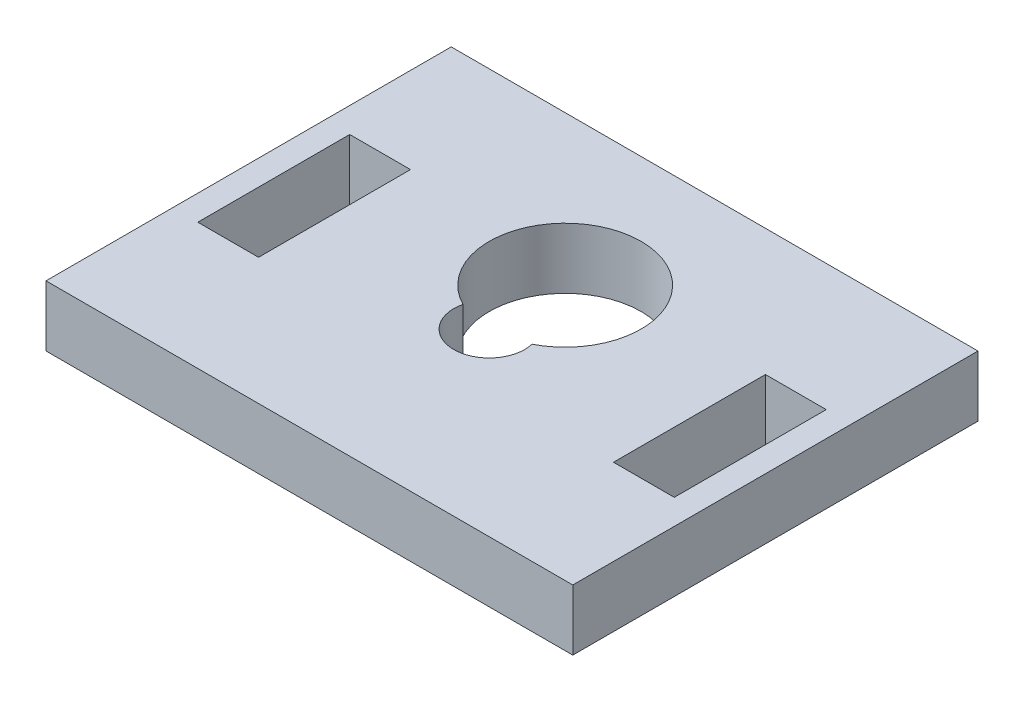
ISO-10303-21;
HEADER;
FILE_DESCRIPTION(('STEP AP214'),'2;1');
FILE_NAME('part.step','',(''),(''),'','','');
FILE_SCHEMA(('AUTOMOTIVE_DESIGN { 1 0 10303 214 1 1 1 1 }'));
ENDSEC;
DATA;
#1=APPLICATION_CONTEXT('core data for automotive mechanical design processes');
#2=APPLICATION_PROTOCOL_DEFINITION('international standard','automotive_design',2000,#1);
#3=PRODUCT_CONTEXT('',#1,'mechanical');
#4=PRODUCT('Part','Part','',(#3));
#5=PRODUCT_RELATED_PRODUCT_CATEGORY('part','',(#4));
#6=PRODUCT_DEFINITION_FORMATION('','',#4);
#7=PRODUCT_DEFINITION_CONTEXT('part definition',#1,'design');
#8=PRODUCT_DEFINITION('design','',#6,#7);
#9=PRODUCT_DEFINITION_SHAPE('','',#8);
#10=(LENGTH_UNIT() NAMED_UNIT(*) SI_UNIT(.MILLI.,.METRE.));
#11=(NAMED_UNIT(*) PLANE_ANGLE_UNIT() SI_UNIT($,.RADIAN.));
#12=(NAMED_UNIT(*) SI_UNIT($,.STERADIAN.) SOLID_ANGLE_UNIT());
#13=UNCERTAINTY_MEASURE_WITH_UNIT(LENGTH_MEASURE(1.E-05),#10,'distance_accuracy_value','');
#14=(GEOMETRIC_REPRESENTATION_CONTEXT(3) GLOBAL_UNCERTAINTY_ASSIGNED_CONTEXT((#13)) GLOBAL_UNIT_ASSIGNED_CONTEXT((#10,
#11,#12)) REPRESENTATION_CONTEXT('',''));
#15=CARTESIAN_POINT('',(0.,0.,0.));
#16=DIRECTION('',(0.,0.,1.));
#17=DIRECTION('',(1.,0.,0.));
#18=AXIS2_PLACEMENT_3D('',#15,#16,#17);
#19=CARTESIAN_POINT('',(26.,3.,20.));
#20=DIRECTION('',(-1.,0.,0.));
#21=DIRECTION('',(0.,0.,1.));
#22=AXIS2_PLACEMENT_3D('',#19,#20,#21);
#23=PLANE('',#22);
#24=DIRECTION('',(0.,0.,-1.));
#25=VECTOR('',#24,1.);
#26=CARTESIAN_POINT('',(26.,-3.,20.));
#27=LINE('',#26,#25);
#28=CARTESIAN_POINT('',(26.,-3.,20.));
#29=VERTEX_POINT('',#28);
#30=CARTESIAN_POINT('',(26.,-3.,-20.));
#31=VERTEX_POINT('',#30);
#32=EDGE_CURVE('E178',#29,#31,#27,.T.);
#33=ORIENTED_EDGE('',*,*,#32,.T.);
#34=DIRECTION('',(0.,-1.,0.));
#35=VECTOR('',#34,1.);
#36=CARTESIAN_POINT('',(26.,3.,-20.));
#37=LINE('',#36,#35);
#38=CARTESIAN_POINT('',(26.,3.,-20.));
#39=VERTEX_POINT('',#38);
#40=EDGE_CURVE('E11',#39,#31,#37,.T.);
#41=ORIENTED_EDGE('',*,*,#40,.F.);
#42=DIRECTION('',(0.,0.,-1.));
#43=VECTOR('',#42,1.);
#44=CARTESIAN_POINT('',(26.,3.,20.));
#45=LINE('',#44,#43);
#46=CARTESIAN_POINT('',(26.,3.,20.));
#47=VERTEX_POINT('',#46);
#48=EDGE_CURVE('E215',#47,#39,#45,.T.);
#49=ORIENTED_EDGE('',*,*,#48,.F.);
#50=DIRECTION('',(0.,-1.,0.));
#51=VECTOR('',#50,1.);
#52=CARTESIAN_POINT('',(26.,3.,20.));
#53=LINE('',#52,#51);
#54=EDGE_CURVE('E225',#47,#29,#53,.T.);
#55=ORIENTED_EDGE('',*,*,#54,.T.);
#56=EDGE_LOOP('',(#33,#41,#49,#55));
#57=FACE_BOUND('',#56,.T.);
#58=ADVANCED_FACE('F33',(#57),#23,.F.);
#59=CARTESIAN_POINT('',(-26.,3.,-20.));
#60=DIRECTION('',(0.,0.,1.));
#61=DIRECTION('',(1.,0.,0.));
#62=AXIS2_PLACEMENT_3D('',#59,#60,#61);
#63=PLANE('',#62);
#64=DIRECTION('',(-1.,0.,0.));
#65=VECTOR('',#64,1.);
#66=CARTESIAN_POINT('',(-26.,-3.,-20.));
#67=LINE('',#66,#65);
#68=CARTESIAN_POINT('',(-26.,-3.,-20.));
#69=VERTEX_POINT('',#68);
#70=EDGE_CURVE('E228',#31,#69,#67,.T.);
#71=ORIENTED_EDGE('',*,*,#70,.T.);
#72=DIRECTION('',(0.,-1.,0.));
#73=VECTOR('',#72,1.);
#74=CARTESIAN_POINT('',(-26.,3.,-20.));
#75=LINE('',#74,#73);
#76=CARTESIAN_POINT('',(-26.,3.,-20.));
#77=VERTEX_POINT('',#76);
#78=EDGE_CURVE('E40',#77,#69,#75,.T.);
#79=ORIENTED_EDGE('',*,*,#78,.F.);
#80=DIRECTION('',(-1.,0.,0.));
#81=VECTOR('',#80,1.);
#82=CARTESIAN_POINT('',(-26.,3.,-20.));
#83=LINE('',#82,#81);
#84=EDGE_CURVE('E218',#39,#77,#83,.T.);
#85=ORIENTED_EDGE('',*,*,#84,.F.);
#86=ORIENTED_EDGE('',*,*,#40,.T.);
#87=EDGE_LOOP('',(#71,#79,#85,#86));
#88=FACE_BOUND('',#87,.T.);
#89=ADVANCED_FACE('F257',(#88),#63,.F.);
#90=CARTESIAN_POINT('',(-26.,3.,20.));
#91=DIRECTION('',(1.,0.,0.));
#92=DIRECTION('',(0.,0.,-1.));
#93=AXIS2_PLACEMENT_3D('',#90,#91,#92);
#94=PLANE('',#93);
#95=DIRECTION('',(0.,0.,1.));
#96=VECTOR('',#95,1.);
#97=CARTESIAN_POINT('',(-26.,-3.,20.));
#98=LINE('',#97,#96);
#99=CARTESIAN_POINT('',(-26.,-3.,20.));
#100=VERTEX_POINT('',#99);
#101=EDGE_CURVE('E230',#69,#100,#98,.T.);
#102=ORIENTED_EDGE('',*,*,#101,.T.);
#103=DIRECTION('',(0.,-1.,0.));
#104=VECTOR('',#103,1.);
#105=CARTESIAN_POINT('',(-26.,3.,20.));
#106=LINE('',#105,#104);
#107=CARTESIAN_POINT('',(-26.,3.,20.));
#108=VERTEX_POINT('',#107);
#109=EDGE_CURVE('E235',#108,#100,#106,.T.);
#110=ORIENTED_EDGE('',*,*,#109,.F.);
#111=DIRECTION('',(0.,0.,1.));
#112=VECTOR('',#111,1.);
#113=CARTESIAN_POINT('',(-26.,3.,20.));
#114=LINE('',#113,#112);
#115=EDGE_CURVE('E221',#77,#108,#114,.T.);
#116=ORIENTED_EDGE('',*,*,#115,.F.);
#117=ORIENTED_EDGE('',*,*,#78,.T.);
#118=EDGE_LOOP('',(#102,#110,#116,#117));
#119=FACE_BOUND('',#118,.T.);
#120=ADVANCED_FACE('F242',(#119),#94,.F.);
#121=CARTESIAN_POINT('',(-26.,3.,20.));
#122=DIRECTION('',(0.,0.,-1.));
#123=DIRECTION('',(-1.,0.,0.));
#124=AXIS2_PLACEMENT_3D('',#121,#122,#123);
#125=PLANE('',#124);
#126=DIRECTION('',(1.,0.,0.));
#127=VECTOR('',#126,1.);
#128=CARTESIAN_POINT('',(-26.,-3.,20.));
#129=LINE('',#128,#127);
#130=EDGE_CURVE('E219',#100,#29,#129,.T.);
#131=ORIENTED_EDGE('',*,*,#130,.T.);
#132=ORIENTED_EDGE('',*,*,#54,.F.);
#133=DIRECTION('',(1.,0.,0.));
#134=VECTOR('',#133,1.);
#135=CARTESIAN_POINT('',(-26.,3.,20.));
#136=LINE('',#135,#134);
#137=EDGE_CURVE('E223',#108,#47,#136,.T.);
#138=ORIENTED_EDGE('',*,*,#137,.F.);
#139=ORIENTED_EDGE('',*,*,#109,.T.);
#140=EDGE_LOOP('',(#131,#132,#138,#139));
#141=FACE_BOUND('',#140,.T.);
#142=ADVANCED_FACE('F250',(#141),#125,.F.);
#143=CARTESIAN_POINT('',(0.,3.,0.));
#144=DIRECTION('',(0.,-1.,0.));
#145=DIRECTION('',(0.,0.,-1.));
#146=AXIS2_PLACEMENT_3D('',#143,#144,#145);
#147=PLANE('',#146);
#148=CARTESIAN_POINT('',(-2.29850860566927E-12,3.,-5.25000000000031));
#149=DIRECTION('',(0.,1.,0.));
#150=DIRECTION('',(0.,0.,1.));
#151=AXIS2_PLACEMENT_3D('',#148,#149,#150);
#152=CIRCLE('',#151,7.5);
#153=CARTESIAN_POINT('',(3.40338883402321,3.,1.43333333333198));
#154=VERTEX_POINT('',#153);
#155=CARTESIAN_POINT('',(-3.40338883402371,3.,1.43333333333407));
#156=VERTEX_POINT('',#155);
#157=EDGE_CURVE('E144',#154,#156,#152,.T.);
#158=ORIENTED_EDGE('',*,*,#157,.F.);
#159=CARTESIAN_POINT('',(0.,3.,2.24999999999969));
#160=DIRECTION('',(0.,1.,0.));
#161=DIRECTION('',(0.,0.,1.));
#162=AXIS2_PLACEMENT_3D('',#159,#160,#161);
#163=CIRCLE('',#162,3.5);
#164=EDGE_CURVE('E47',#156,#154,#163,.T.);
#165=ORIENTED_EDGE('',*,*,#164,.F.);
#166=EDGE_LOOP('',(#158,#165));
#167=FACE_BOUND('',#166,.T.);
#168=DIRECTION('',(1.,0.,0.));
#169=VECTOR('',#168,1.);
#170=CARTESIAN_POINT('',(-23.5187499999947,3.,7.5));
#171=LINE('',#170,#169);
#172=CARTESIAN_POINT('',(-23.5187499999947,3.,7.5));
#173=VERTEX_POINT('',#172);
#174=CARTESIAN_POINT('',(-17.5187499999947,3.,7.5));
#175=VERTEX_POINT('',#174);
#176=EDGE_CURVE('E167',#173,#175,#171,.T.);
#177=ORIENTED_EDGE('',*,*,#176,.F.);
#178=DIRECTION('',(0.,0.,1.));
#179=VECTOR('',#178,1.);
#180=CARTESIAN_POINT('',(-23.5187499999947,3.,-7.5));
#181=LINE('',#180,#179);
#182=CARTESIAN_POINT('',(-23.5187499999947,3.,-7.5));
#183=VERTEX_POINT('',#182);
#184=EDGE_CURVE('E165',#183,#173,#181,.T.);
#185=ORIENTED_EDGE('',*,*,#184,.F.);
#186=DIRECTION('',(-1.,0.,0.));
#187=VECTOR('',#186,1.);
#188=CARTESIAN_POINT('',(-23.5187499999947,3.,-7.5));
#189=LINE('',#188,#187);
#190=CARTESIAN_POINT('',(-17.5187499999947,3.,-7.5));
#191=VERTEX_POINT('',#190);
#192=EDGE_CURVE('E155',#191,#183,#189,.T.);
#193=ORIENTED_EDGE('',*,*,#192,.F.);
#194=DIRECTION('',(0.,0.,-1.));
#195=VECTOR('',#194,1.);
#196=CARTESIAN_POINT('',(-17.5187499999947,3.,-7.5));
#197=LINE('',#196,#195);
#198=EDGE_CURVE('E171',#175,#191,#197,.T.);
#199=ORIENTED_EDGE('',*,*,#198,.F.);
#200=EDGE_LOOP('',(#177,#185,#193,#199));
#201=FACE_BOUND('',#200,.T.);
#202=DIRECTION('',(1.,0.,0.));
#203=VECTOR('',#202,1.);
#204=CARTESIAN_POINT('',(17.5187499999947,3.,7.49999999999999));
#205=LINE('',#204,#203);
#206=CARTESIAN_POINT('',(17.5187499999947,3.,7.49999999999999));
#207=VERTEX_POINT('',#206);
#208=CARTESIAN_POINT('',(23.5187499999947,3.,7.49999999999999));
#209=VERTEX_POINT('',#208);
#210=EDGE_CURVE('E200',#207,#209,#205,.T.);
#211=ORIENTED_EDGE('',*,*,#210,.F.);
#212=DIRECTION('',(0.,0.,1.));
#213=VECTOR('',#212,1.);
#214=CARTESIAN_POINT('',(17.5187499999947,3.,-7.50000000000001));
#215=LINE('',#214,#213);
#216=CARTESIAN_POINT('',(17.5187499999947,3.,-7.50000000000001));
#217=VERTEX_POINT('',#216);
#218=EDGE_CURVE('E149',#217,#207,#215,.T.);
#219=ORIENTED_EDGE('',*,*,#218,.F.);
#220=DIRECTION('',(-1.,0.,0.));
#221=VECTOR('',#220,1.);
#222=CARTESIAN_POINT('',(17.5187499999947,3.,-7.50000000000001));
#223=LINE('',#222,#221);
#224=CARTESIAN_POINT('',(23.5187499999947,3.,-7.50000000000001));
#225=VERTEX_POINT('',#224);
#226=EDGE_CURVE('E189',#225,#217,#223,.T.);
#227=ORIENTED_EDGE('',*,*,#226,.F.);
#228=DIRECTION('',(0.,0.,-1.));
#229=VECTOR('',#228,1.);
#230=CARTESIAN_POINT('',(23.5187499999947,3.,-7.50000000000001));
#231=LINE('',#230,#229);
#232=EDGE_CURVE('E203',#209,#225,#231,.T.);
#233=ORIENTED_EDGE('',*,*,#232,.F.);
#234=EDGE_LOOP('',(#211,#219,#227,#233));
#235=FACE_BOUND('',#234,.T.);
#236=ORIENTED_EDGE('',*,*,#48,.T.);
#237=ORIENTED_EDGE('',*,*,#84,.T.);
#238=ORIENTED_EDGE('',*,*,#115,.T.);
#239=ORIENTED_EDGE('',*,*,#137,.T.);
#240=EDGE_LOOP('',(#236,#237,#238,#239));
#241=FACE_BOUND('',#240,.T.);
#242=ADVANCED_FACE('F256',(#167,#201,#235,#241),#147,.F.);
#243=CARTESIAN_POINT('',(0.,-3.,0.));
#244=DIRECTION('',(0.,-1.,0.));
#245=DIRECTION('',(0.,0.,-1.));
#246=AXIS2_PLACEMENT_3D('',#243,#244,#245);
#247=PLANE('',#246);
#248=CARTESIAN_POINT('',(0.,-3.,2.24999999999969));
#249=DIRECTION('',(0.,1.,0.));
#250=DIRECTION('',(0.,0.,1.));
#251=AXIS2_PLACEMENT_3D('',#248,#249,#250);
#252=CIRCLE('',#251,3.5);
#253=CARTESIAN_POINT('',(-3.40338883402371,-3.,1.43333333333407));
#254=VERTEX_POINT('',#253);
#255=CARTESIAN_POINT('',(3.40338883402321,-3.,1.43333333333198));
#256=VERTEX_POINT('',#255);
#257=EDGE_CURVE('E52',#254,#256,#252,.T.);
#258=ORIENTED_EDGE('',*,*,#257,.T.);
#259=CARTESIAN_POINT('',(-2.29850860566927E-12,-3.,-5.25000000000031));
#260=DIRECTION('',(0.,1.,0.));
#261=DIRECTION('',(0.,0.,1.));
#262=AXIS2_PLACEMENT_3D('',#259,#260,#261);
#263=CIRCLE('',#262,7.5);
#264=EDGE_CURVE('E136',#256,#254,#263,.T.);
#265=ORIENTED_EDGE('',*,*,#264,.T.);
#266=EDGE_LOOP('',(#258,#265));
#267=FACE_BOUND('',#266,.T.);
#268=DIRECTION('',(0.,0.,1.));
#269=VECTOR('',#268,1.);
#270=CARTESIAN_POINT('',(-23.5187499999947,-3.,-7.5));
#271=LINE('',#270,#269);
#272=CARTESIAN_POINT('',(-23.5187499999947,-3.,-7.5));
#273=VERTEX_POINT('',#272);
#274=CARTESIAN_POINT('',(-23.5187499999947,-3.,7.5));
#275=VERTEX_POINT('',#274);
#276=EDGE_CURVE('E151',#273,#275,#271,.T.);
#277=ORIENTED_EDGE('',*,*,#276,.T.);
#278=DIRECTION('',(1.,0.,0.));
#279=VECTOR('',#278,1.);
#280=CARTESIAN_POINT('',(-23.5187499999947,-3.,7.5));
#281=LINE('',#280,#279);
#282=CARTESIAN_POINT('',(-17.5187499999947,-3.,7.5));
#283=VERTEX_POINT('',#282);
#284=EDGE_CURVE('E154',#275,#283,#281,.T.);
#285=ORIENTED_EDGE('',*,*,#284,.T.);
#286=DIRECTION('',(0.,0.,-1.));
#287=VECTOR('',#286,1.);
#288=CARTESIAN_POINT('',(-17.5187499999947,-3.,-7.5));
#289=LINE('',#288,#287);
#290=CARTESIAN_POINT('',(-17.5187499999947,-3.,-7.5));
#291=VERTEX_POINT('',#290);
#292=EDGE_CURVE('E158',#283,#291,#289,.T.);
#293=ORIENTED_EDGE('',*,*,#292,.T.);
#294=DIRECTION('',(-1.,0.,0.));
#295=VECTOR('',#294,1.);
#296=CARTESIAN_POINT('',(-23.5187499999947,-3.,-7.5));
#297=LINE('',#296,#295);
#298=EDGE_CURVE('E161',#291,#273,#297,.T.);
#299=ORIENTED_EDGE('',*,*,#298,.T.);
#300=EDGE_LOOP('',(#277,#285,#293,#299));
#301=FACE_BOUND('',#300,.T.);
#302=DIRECTION('',(0.,0.,1.));
#303=VECTOR('',#302,1.);
#304=CARTESIAN_POINT('',(17.5187499999947,-3.,-7.50000000000001));
#305=LINE('',#304,#303);
#306=CARTESIAN_POINT('',(17.5187499999947,-3.,-7.50000000000001));
#307=VERTEX_POINT('',#306);
#308=CARTESIAN_POINT('',(17.5187499999947,-3.,7.49999999999999));
#309=VERTEX_POINT('',#308);
#310=EDGE_CURVE('E185',#307,#309,#305,.T.);
#311=ORIENTED_EDGE('',*,*,#310,.T.);
#312=DIRECTION('',(1.,0.,0.));
#313=VECTOR('',#312,1.);
#314=CARTESIAN_POINT('',(17.5187499999947,-3.,7.49999999999999));
#315=LINE('',#314,#313);
#316=CARTESIAN_POINT('',(23.5187499999947,-3.,7.49999999999999));
#317=VERTEX_POINT('',#316);
#318=EDGE_CURVE('E188',#309,#317,#315,.T.);
#319=ORIENTED_EDGE('',*,*,#318,.T.);
#320=DIRECTION('',(0.,0.,-1.));
#321=VECTOR('',#320,1.);
#322=CARTESIAN_POINT('',(23.5187499999947,-3.,-7.50000000000001));
#323=LINE('',#322,#321);
#324=CARTESIAN_POINT('',(23.5187499999947,-3.,-7.50000000000001));
#325=VERTEX_POINT('',#324);
#326=EDGE_CURVE('E192',#317,#325,#323,.T.);
#327=ORIENTED_EDGE('',*,*,#326,.T.);
#328=DIRECTION('',(-1.,0.,0.));
#329=VECTOR('',#328,1.);
#330=CARTESIAN_POINT('',(17.5187499999947,-3.,-7.50000000000001));
#331=LINE('',#330,#329);
#332=EDGE_CURVE('E195',#325,#307,#331,.T.);
#333=ORIENTED_EDGE('',*,*,#332,.T.);
#334=EDGE_LOOP('',(#311,#319,#327,#333));
#335=FACE_BOUND('',#334,.T.);
#336=ORIENTED_EDGE('',*,*,#32,.F.);
#337=ORIENTED_EDGE('',*,*,#130,.F.);
#338=ORIENTED_EDGE('',*,*,#101,.F.);
#339=ORIENTED_EDGE('',*,*,#70,.F.);
#340=EDGE_LOOP('',(#336,#337,#338,#339));
#341=FACE_BOUND('',#340,.T.);
#342=ADVANCED_FACE('F142',(#267,#301,#335,#341),#247,.T.);
#343=CARTESIAN_POINT('',(17.5187499999947,-3.,-7.50000000000001));
#344=DIRECTION('',(-1.,0.,0.));
#345=DIRECTION('',(0.,0.,1.));
#346=AXIS2_PLACEMENT_3D('',#343,#344,#345);
#347=PLANE('',#346);
#348=ORIENTED_EDGE('',*,*,#218,.T.);
#349=DIRECTION('',(0.,1.,0.));
#350=VECTOR('',#349,1.);
#351=CARTESIAN_POINT('',(17.5187499999947,-3.,7.49999999999999));
#352=LINE('',#351,#350);
#353=EDGE_CURVE('E198',#309,#207,#352,.T.);
#354=ORIENTED_EDGE('',*,*,#353,.F.);
#355=ORIENTED_EDGE('',*,*,#310,.F.);
#356=DIRECTION('',(0.,1.,0.));
#357=VECTOR('',#356,1.);
#358=CARTESIAN_POINT('',(17.5187499999947,-3.,-7.50000000000001));
#359=LINE('',#358,#357);
#360=EDGE_CURVE('E168',#307,#217,#359,.T.);
#361=ORIENTED_EDGE('',*,*,#360,.T.);
#362=EDGE_LOOP('',(#348,#354,#355,#361));
#363=FACE_BOUND('',#362,.T.);
#364=ADVANCED_FACE('F269',(#363),#347,.F.);
#365=CARTESIAN_POINT('',(17.5187499999947,-3.,-7.50000000000001));
#366=DIRECTION('',(0.,0.,-1.));
#367=DIRECTION('',(-1.,0.,0.));
#368=AXIS2_PLACEMENT_3D('',#365,#366,#367);
#369=PLANE('',#368);
#370=ORIENTED_EDGE('',*,*,#226,.T.);
#371=ORIENTED_EDGE('',*,*,#360,.F.);
#372=ORIENTED_EDGE('',*,*,#332,.F.);
#373=DIRECTION('',(0.,1.,0.));
#374=VECTOR('',#373,1.);
#375=CARTESIAN_POINT('',(23.5187499999947,-3.,-7.50000000000001));
#376=LINE('',#375,#374);
#377=EDGE_CURVE('E209',#325,#225,#376,.T.);
#378=ORIENTED_EDGE('',*,*,#377,.T.);
#379=EDGE_LOOP('',(#370,#371,#372,#378));
#380=FACE_BOUND('',#379,.T.);
#381=ADVANCED_FACE('F275',(#380),#369,.F.);
#382=CARTESIAN_POINT('',(23.5187499999947,-3.,-7.50000000000001));
#383=DIRECTION('',(1.,0.,0.));
#384=DIRECTION('',(0.,0.,-1.));
#385=AXIS2_PLACEMENT_3D('',#382,#383,#384);
#386=PLANE('',#385);
#387=ORIENTED_EDGE('',*,*,#232,.T.);
#388=ORIENTED_EDGE('',*,*,#377,.F.);
#389=ORIENTED_EDGE('',*,*,#326,.F.);
#390=DIRECTION('',(0.,1.,0.));
#391=VECTOR('',#390,1.);
#392=CARTESIAN_POINT('',(23.5187499999947,-3.,7.49999999999999));
#393=LINE('',#392,#391);
#394=EDGE_CURVE('E211',#317,#209,#393,.T.);
#395=ORIENTED_EDGE('',*,*,#394,.T.);
#396=EDGE_LOOP('',(#387,#388,#389,#395));
#397=FACE_BOUND('',#396,.T.);
#398=ADVANCED_FACE('F281',(#397),#386,.F.);
#399=CARTESIAN_POINT('',(17.5187499999947,-3.,7.49999999999999));
#400=DIRECTION('',(0.,0.,1.));
#401=DIRECTION('',(1.,0.,0.));
#402=AXIS2_PLACEMENT_3D('',#399,#400,#401);
#403=PLANE('',#402);
#404=ORIENTED_EDGE('',*,*,#210,.T.);
#405=ORIENTED_EDGE('',*,*,#394,.F.);
#406=ORIENTED_EDGE('',*,*,#318,.F.);
#407=ORIENTED_EDGE('',*,*,#353,.T.);
#408=EDGE_LOOP('',(#404,#405,#406,#407));
#409=FACE_BOUND('',#408,.T.);
#410=ADVANCED_FACE('F277',(#409),#403,.F.);
#411=CARTESIAN_POINT('',(-23.5187499999947,-3.,-7.5));
#412=DIRECTION('',(-1.,0.,0.));
#413=DIRECTION('',(0.,0.,1.));
#414=AXIS2_PLACEMENT_3D('',#411,#412,#413);
#415=PLANE('',#414);
#416=ORIENTED_EDGE('',*,*,#184,.T.);
#417=DIRECTION('',(0.,1.,0.));
#418=VECTOR('',#417,1.);
#419=CARTESIAN_POINT('',(-23.5187499999947,-3.,7.5));
#420=LINE('',#419,#418);
#421=EDGE_CURVE('E164',#275,#173,#420,.T.);
#422=ORIENTED_EDGE('',*,*,#421,.F.);
#423=ORIENTED_EDGE('',*,*,#276,.F.);
#424=DIRECTION('',(0.,1.,0.));
#425=VECTOR('',#424,1.);
#426=CARTESIAN_POINT('',(-23.5187499999947,-3.,-7.5));
#427=LINE('',#426,#425);
#428=EDGE_CURVE('E176',#273,#183,#427,.T.);
#429=ORIENTED_EDGE('',*,*,#428,.T.);
#430=EDGE_LOOP('',(#416,#422,#423,#429));
#431=FACE_BOUND('',#430,.T.);
#432=ADVANCED_FACE('F280',(#431),#415,.F.);
#433=CARTESIAN_POINT('',(-23.5187499999947,-3.,-7.5));
#434=DIRECTION('',(0.,0.,-1.));
#435=DIRECTION('',(-1.,0.,0.));
#436=AXIS2_PLACEMENT_3D('',#433,#434,#435);
#437=PLANE('',#436);
#438=ORIENTED_EDGE('',*,*,#192,.T.);
#439=ORIENTED_EDGE('',*,*,#428,.F.);
#440=ORIENTED_EDGE('',*,*,#298,.F.);
#441=DIRECTION('',(0.,1.,0.));
#442=VECTOR('',#441,1.);
#443=CARTESIAN_POINT('',(-17.5187499999947,-3.,-7.5));
#444=LINE('',#443,#442);
#445=EDGE_CURVE('E179',#291,#191,#444,.T.);
#446=ORIENTED_EDGE('',*,*,#445,.T.);
#447=EDGE_LOOP('',(#438,#439,#440,#446));
#448=FACE_BOUND('',#447,.T.);
#449=ADVANCED_FACE('F291',(#448),#437,.F.);
#450=CARTESIAN_POINT('',(-17.5187499999947,-3.,-7.5));
#451=DIRECTION('',(1.,0.,0.));
#452=DIRECTION('',(0.,0.,-1.));
#453=AXIS2_PLACEMENT_3D('',#450,#451,#452);
#454=PLANE('',#453);
#455=ORIENTED_EDGE('',*,*,#198,.T.);
#456=ORIENTED_EDGE('',*,*,#445,.F.);
#457=ORIENTED_EDGE('',*,*,#292,.F.);
#458=DIRECTION('',(0.,1.,0.));
#459=VECTOR('',#458,1.);
#460=CARTESIAN_POINT('',(-17.5187499999947,-3.,7.5));
#461=LINE('',#460,#459);
#462=EDGE_CURVE('E181',#283,#175,#461,.T.);
#463=ORIENTED_EDGE('',*,*,#462,.T.);
#464=EDGE_LOOP('',(#455,#456,#457,#463));
#465=FACE_BOUND('',#464,.T.);
#466=ADVANCED_FACE('F296',(#465),#454,.F.);
#467=CARTESIAN_POINT('',(-23.5187499999947,-3.,7.5));
#468=DIRECTION('',(0.,0.,1.));
#469=DIRECTION('',(1.,0.,0.));
#470=AXIS2_PLACEMENT_3D('',#467,#468,#469);
#471=PLANE('',#470);
#472=ORIENTED_EDGE('',*,*,#176,.T.);
#473=ORIENTED_EDGE('',*,*,#462,.F.);
#474=ORIENTED_EDGE('',*,*,#284,.F.);
#475=ORIENTED_EDGE('',*,*,#421,.T.);
#476=EDGE_LOOP('',(#472,#473,#474,#475));
#477=FACE_BOUND('',#476,.T.);
#478=ADVANCED_FACE('F293',(#477),#471,.F.);
#479=CARTESIAN_POINT('',(0.,-3.,2.24999999999969));
#480=DIRECTION('',(0.,1.,0.));
#481=DIRECTION('',(0.,0.,1.));
#482=AXIS2_PLACEMENT_3D('',#479,#480,#481);
#483=CYLINDRICAL_SURFACE('',#482,3.5);
#484=ORIENTED_EDGE('',*,*,#164,.T.);
#485=DIRECTION('',(0.,1.,0.));
#486=VECTOR('',#485,1.);
#487=CARTESIAN_POINT('',(3.40338883402321,-3.,1.43333333333198));
#488=LINE('',#487,#486);
#489=EDGE_CURVE('E129',#256,#154,#488,.T.);
#490=ORIENTED_EDGE('',*,*,#489,.F.);
#491=ORIENTED_EDGE('',*,*,#257,.F.);
#492=DIRECTION('',(0.,1.,0.));
#493=VECTOR('',#492,1.);
#494=CARTESIAN_POINT('',(-3.40338883402371,-3.,1.43333333333407));
#495=LINE('',#494,#493);
#496=EDGE_CURVE('E135',#254,#156,#495,.T.);
#497=ORIENTED_EDGE('',*,*,#496,.T.);
#498=EDGE_LOOP('',(#484,#490,#491,#497));
#499=FACE_BOUND('',#498,.T.);
#500=ADVANCED_FACE('F131',(#499),#483,.F.);
#501=CARTESIAN_POINT('',(-2.29850860566927E-12,-3.,-5.25000000000031));
#502=DIRECTION('',(0.,1.,0.));
#503=DIRECTION('',(0.,0.,1.));
#504=AXIS2_PLACEMENT_3D('',#501,#502,#503);
#505=CYLINDRICAL_SURFACE('',#504,7.5);
#506=ORIENTED_EDGE('',*,*,#157,.T.);
#507=ORIENTED_EDGE('',*,*,#496,.F.);
#508=ORIENTED_EDGE('',*,*,#264,.F.);
#509=ORIENTED_EDGE('',*,*,#489,.T.);
#510=EDGE_LOOP('',(#506,#507,#508,#509));
#511=FACE_BOUND('',#510,.T.);
#512=ADVANCED_FACE('F139',(#511),#505,.F.);
#513=CLOSED_SHELL('',(#58,#89,#120,#142,#242,#342,#364,#381,#398,#410,#432,#449,#466,#478,#500,#512));
#514=MANIFOLD_SOLID_BREP('B2',#513);
#515=ADVANCED_BREP_SHAPE_REPRESENTATION('',(#18,#514),#14);
#516=SHAPE_DEFINITION_REPRESENTATION(#9,#515);
ENDSEC;
END-ISO-10303-21;
